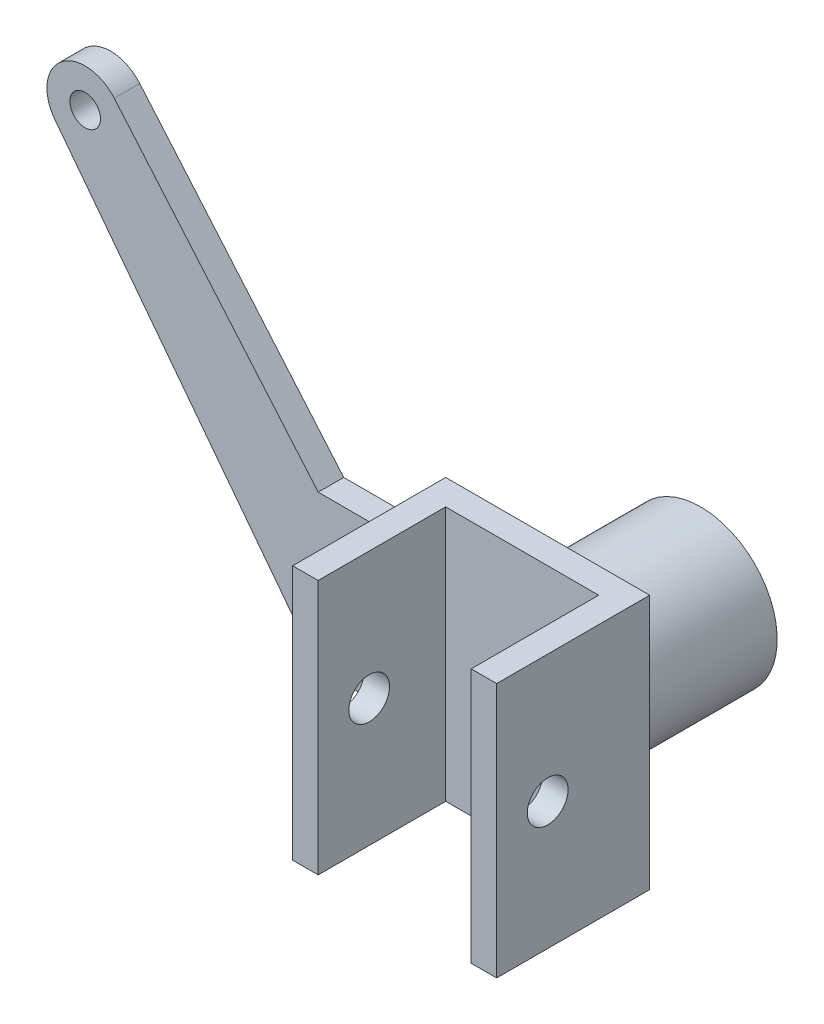
ISO-10303-21;
HEADER;
FILE_DESCRIPTION(('STEP AP214'),'2;1');
FILE_NAME('part.step','',(''),(''),'','','');
FILE_SCHEMA(('AUTOMOTIVE_DESIGN { 1 0 10303 214 1 1 1 1 }'));
ENDSEC;
DATA;
#1=APPLICATION_CONTEXT('core data for automotive mechanical design processes');
#2=APPLICATION_PROTOCOL_DEFINITION('international standard','automotive_design',2000,#1);
#3=PRODUCT_CONTEXT('',#1,'mechanical');
#4=PRODUCT('Part','Part','',(#3));
#5=PRODUCT_RELATED_PRODUCT_CATEGORY('part','',(#4));
#6=PRODUCT_DEFINITION_FORMATION('','',#4);
#7=PRODUCT_DEFINITION_CONTEXT('part definition',#1,'design');
#8=PRODUCT_DEFINITION('design','',#6,#7);
#9=PRODUCT_DEFINITION_SHAPE('','',#8);
#10=(LENGTH_UNIT() NAMED_UNIT(*) SI_UNIT(.MILLI.,.METRE.));
#11=(NAMED_UNIT(*) PLANE_ANGLE_UNIT() SI_UNIT($,.RADIAN.));
#12=(NAMED_UNIT(*) SI_UNIT($,.STERADIAN.) SOLID_ANGLE_UNIT());
#13=UNCERTAINTY_MEASURE_WITH_UNIT(LENGTH_MEASURE(1.E-05),#10,'distance_accuracy_value','');
#14=(GEOMETRIC_REPRESENTATION_CONTEXT(3) GLOBAL_UNCERTAINTY_ASSIGNED_CONTEXT((#13)) GLOBAL_UNIT_ASSIGNED_CONTEXT((#10,
#11,#12)) REPRESENTATION_CONTEXT('',''));
#15=CARTESIAN_POINT('',(0.,0.,0.));
#16=DIRECTION('',(0.,0.,1.));
#17=DIRECTION('',(1.,0.,0.));
#18=AXIS2_PLACEMENT_3D('',#15,#16,#17);
#19=CARTESIAN_POINT('',(-20.,-25.,5.));
#20=DIRECTION('',(1.,0.,0.));
#21=DIRECTION('',(0.,0.,-1.));
#22=AXIS2_PLACEMENT_3D('',#19,#20,#21);
#23=PLANE('',#22);
#24=CARTESIAN_POINT('',(-20.,0.,20.));
#25=DIRECTION('',(-1.,0.,0.));
#26=DIRECTION('',(0.,0.,1.));
#27=AXIS2_PLACEMENT_3D('',#24,#25,#26);
#28=CIRCLE('',#27,4.);
#29=CARTESIAN_POINT('',(-20.,0.,24.));
#30=VERTEX_POINT('',#29);
#31=EDGE_CURVE('E195',#30,#30,#28,.T.);
#32=ORIENTED_EDGE('',*,*,#31,.F.);
#33=EDGE_LOOP('',(#32));
#34=FACE_BOUND('',#33,.T.);
#35=DIRECTION('',(0.,0.,-1.));
#36=VECTOR('',#35,1.);
#37=CARTESIAN_POINT('',(-20.,15.,5.));
#38=LINE('',#37,#36);
#39=CARTESIAN_POINT('',(-20.,15.,5.));
#40=VERTEX_POINT('',#39);
#41=CARTESIAN_POINT('',(-20.,15.,0.));
#42=VERTEX_POINT('',#41);
#43=EDGE_CURVE('E49',#40,#42,#38,.T.);
#44=ORIENTED_EDGE('',*,*,#43,.F.);
#45=DIRECTION('',(0.,1.,0.));
#46=VECTOR('',#45,1.);
#47=CARTESIAN_POINT('',(-20.,-15.,5.));
#48=LINE('',#47,#46);
#49=CARTESIAN_POINT('',(-20.,-15.,5.));
#50=VERTEX_POINT('',#49);
#51=EDGE_CURVE('E182',#50,#40,#48,.T.);
#52=ORIENTED_EDGE('',*,*,#51,.F.);
#53=DIRECTION('',(0.,0.,1.));
#54=VECTOR('',#53,1.);
#55=CARTESIAN_POINT('',(-20.,-15.,5.));
#56=LINE('',#55,#54);
#57=CARTESIAN_POINT('',(-20.,-15.,0.));
#58=VERTEX_POINT('',#57);
#59=EDGE_CURVE('E55',#58,#50,#56,.T.);
#60=ORIENTED_EDGE('',*,*,#59,.F.);
#61=DIRECTION('',(0.,-1.,0.));
#62=VECTOR('',#61,1.);
#63=CARTESIAN_POINT('',(-20.,-25.,0.));
#64=LINE('',#63,#62);
#65=CARTESIAN_POINT('',(-20.,-25.,0.));
#66=VERTEX_POINT('',#65);
#67=EDGE_CURVE('E253',#58,#66,#64,.T.);
#68=ORIENTED_EDGE('',*,*,#67,.T.);
#69=DIRECTION('',(0.,0.,-1.));
#70=VECTOR('',#69,1.);
#71=CARTESIAN_POINT('',(-20.,-25.,5.));
#72=LINE('',#71,#70);
#73=CARTESIAN_POINT('',(-20.,-25.,30.));
#74=VERTEX_POINT('',#73);
#75=EDGE_CURVE('E259',#74,#66,#72,.T.);
#76=ORIENTED_EDGE('',*,*,#75,.F.);
#77=DIRECTION('',(0.,-1.,0.));
#78=VECTOR('',#77,1.);
#79=CARTESIAN_POINT('',(-20.,25.,30.));
#80=LINE('',#79,#78);
#81=CARTESIAN_POINT('',(-20.,25.,30.));
#82=VERTEX_POINT('',#81);
#83=EDGE_CURVE('E224',#82,#74,#80,.T.);
#84=ORIENTED_EDGE('',*,*,#83,.F.);
#85=DIRECTION('',(0.,0.,-1.));
#86=VECTOR('',#85,1.);
#87=CARTESIAN_POINT('',(-20.,25.,5.));
#88=LINE('',#87,#86);
#89=CARTESIAN_POINT('',(-20.,25.,0.));
#90=VERTEX_POINT('',#89);
#91=EDGE_CURVE('E42',#82,#90,#88,.T.);
#92=ORIENTED_EDGE('',*,*,#91,.T.);
#93=EDGE_CURVE('E254',#90,#42,#64,.T.);
#94=ORIENTED_EDGE('',*,*,#93,.T.);
#95=EDGE_LOOP('',(#44,#52,#60,#68,#76,#84,#92,#94));
#96=FACE_BOUND('',#95,.T.);
#97=ADVANCED_FACE('F33',(#34,#96),#23,.F.);
#98=CARTESIAN_POINT('',(0.,0.,5.));
#99=DIRECTION('',(0.,0.,-1.));
#100=DIRECTION('',(-1.,0.,0.));
#101=AXIS2_PLACEMENT_3D('',#98,#99,#100);
#102=PLANE('',#101);
#103=DIRECTION('',(0.,-1.,0.));
#104=VECTOR('',#103,1.);
#105=CARTESIAN_POINT('',(15.,25.,5.));
#106=LINE('',#105,#104);
#107=CARTESIAN_POINT('',(15.,25.,5.));
#108=VERTEX_POINT('',#107);
#109=CARTESIAN_POINT('',(15.,-25.,5.));
#110=VERTEX_POINT('',#109);
#111=EDGE_CURVE('E204',#108,#110,#106,.T.);
#112=ORIENTED_EDGE('',*,*,#111,.F.);
#113=DIRECTION('',(-1.,0.,0.));
#114=VECTOR('',#113,1.);
#115=CARTESIAN_POINT('',(-20.,25.,5.));
#116=LINE('',#115,#114);
#117=CARTESIAN_POINT('',(-15.,25.,5.));
#118=VERTEX_POINT('',#117);
#119=EDGE_CURVE('E243',#108,#118,#116,.T.);
#120=ORIENTED_EDGE('',*,*,#119,.T.);
#121=DIRECTION('',(0.,1.,0.));
#122=VECTOR('',#121,1.);
#123=CARTESIAN_POINT('',(-15.,25.,5.));
#124=LINE('',#123,#122);
#125=CARTESIAN_POINT('',(-15.,-25.,5.));
#126=VERTEX_POINT('',#125);
#127=EDGE_CURVE('E223',#126,#118,#124,.T.);
#128=ORIENTED_EDGE('',*,*,#127,.F.);
#129=DIRECTION('',(1.,0.,0.));
#130=VECTOR('',#129,1.);
#131=CARTESIAN_POINT('',(-20.,-25.,5.));
#132=LINE('',#131,#130);
#133=EDGE_CURVE('E245',#126,#110,#132,.T.);
#134=ORIENTED_EDGE('',*,*,#133,.T.);
#135=EDGE_LOOP('',(#112,#120,#128,#134));
#136=FACE_BOUND('',#135,.T.);
#137=ADVANCED_FACE('F289',(#136),#102,.F.);
#138=CARTESIAN_POINT('',(20.,-25.,5.));
#139=DIRECTION('',(-1.,0.,0.));
#140=DIRECTION('',(0.,0.,1.));
#141=AXIS2_PLACEMENT_3D('',#138,#139,#140);
#142=PLANE('',#141);
#143=CARTESIAN_POINT('',(20.,0.,20.));
#144=DIRECTION('',(-1.,0.,0.));
#145=DIRECTION('',(0.,0.,1.));
#146=AXIS2_PLACEMENT_3D('',#143,#144,#145);
#147=CIRCLE('',#146,4.);
#148=CARTESIAN_POINT('',(20.,0.,24.));
#149=VERTEX_POINT('',#148);
#150=EDGE_CURVE('E196',#149,#149,#147,.T.);
#151=ORIENTED_EDGE('',*,*,#150,.T.);
#152=EDGE_LOOP('',(#151));
#153=FACE_BOUND('',#152,.T.);
#154=DIRECTION('',(0.,1.,0.));
#155=VECTOR('',#154,1.);
#156=CARTESIAN_POINT('',(20.,-25.,0.));
#157=LINE('',#156,#155);
#158=CARTESIAN_POINT('',(20.,-25.,0.));
#159=VERTEX_POINT('',#158);
#160=CARTESIAN_POINT('',(20.,25.,0.));
#161=VERTEX_POINT('',#160);
#162=EDGE_CURVE('E242',#159,#161,#157,.T.);
#163=ORIENTED_EDGE('',*,*,#162,.T.);
#164=DIRECTION('',(0.,0.,-1.));
#165=VECTOR('',#164,1.);
#166=CARTESIAN_POINT('',(20.,25.,5.));
#167=LINE('',#166,#165);
#168=CARTESIAN_POINT('',(20.,25.,30.));
#169=VERTEX_POINT('',#168);
#170=EDGE_CURVE('E11',#169,#161,#167,.T.);
#171=ORIENTED_EDGE('',*,*,#170,.F.);
#172=DIRECTION('',(0.,1.,0.));
#173=VECTOR('',#172,1.);
#174=CARTESIAN_POINT('',(20.,25.,30.));
#175=LINE('',#174,#173);
#176=CARTESIAN_POINT('',(20.,-25.,30.));
#177=VERTEX_POINT('',#176);
#178=EDGE_CURVE('E205',#177,#169,#175,.T.);
#179=ORIENTED_EDGE('',*,*,#178,.F.);
#180=DIRECTION('',(0.,0.,-1.));
#181=VECTOR('',#180,1.);
#182=CARTESIAN_POINT('',(20.,-25.,5.));
#183=LINE('',#182,#181);
#184=EDGE_CURVE('E248',#177,#159,#183,.T.);
#185=ORIENTED_EDGE('',*,*,#184,.T.);
#186=EDGE_LOOP('',(#163,#171,#179,#185));
#187=FACE_BOUND('',#186,.T.);
#188=ADVANCED_FACE('F35',(#153,#187),#142,.F.);
#189=CARTESIAN_POINT('',(-20.,25.,5.));
#190=DIRECTION('',(0.,-1.,0.));
#191=DIRECTION('',(0.,0.,-1.));
#192=AXIS2_PLACEMENT_3D('',#189,#190,#191);
#193=PLANE('',#192);
#194=DIRECTION('',(-1.,0.,0.));
#195=VECTOR('',#194,1.);
#196=CARTESIAN_POINT('',(-20.,25.,0.));
#197=LINE('',#196,#195);
#198=EDGE_CURVE('E251',#161,#90,#197,.T.);
#199=ORIENTED_EDGE('',*,*,#198,.T.);
#200=ORIENTED_EDGE('',*,*,#91,.F.);
#201=DIRECTION('',(-1.,0.,0.));
#202=VECTOR('',#201,1.);
#203=CARTESIAN_POINT('',(-20.,25.,30.));
#204=LINE('',#203,#202);
#205=CARTESIAN_POINT('',(-15.,25.,30.));
#206=VERTEX_POINT('',#205);
#207=EDGE_CURVE('E231',#206,#82,#204,.T.);
#208=ORIENTED_EDGE('',*,*,#207,.F.);
#209=DIRECTION('',(0.,0.,-1.));
#210=VECTOR('',#209,1.);
#211=CARTESIAN_POINT('',(-15.,25.,30.));
#212=LINE('',#211,#210);
#213=EDGE_CURVE('E234',#206,#118,#212,.T.);
#214=ORIENTED_EDGE('',*,*,#213,.T.);
#215=ORIENTED_EDGE('',*,*,#119,.F.);
#216=DIRECTION('',(0.,0.,-1.));
#217=VECTOR('',#216,1.);
#218=CARTESIAN_POINT('',(15.,25.,30.));
#219=LINE('',#218,#217);
#220=CARTESIAN_POINT('',(15.,25.,30.));
#221=VERTEX_POINT('',#220);
#222=EDGE_CURVE('E220',#221,#108,#219,.T.);
#223=ORIENTED_EDGE('',*,*,#222,.F.);
#224=DIRECTION('',(-1.,0.,0.));
#225=VECTOR('',#224,1.);
#226=CARTESIAN_POINT('',(20.,25.,30.));
#227=LINE('',#226,#225);
#228=EDGE_CURVE('E208',#169,#221,#227,.T.);
#229=ORIENTED_EDGE('',*,*,#228,.F.);
#230=ORIENTED_EDGE('',*,*,#170,.T.);
#231=EDGE_LOOP('',(#199,#200,#208,#214,#215,#223,#229,#230));
#232=FACE_BOUND('',#231,.T.);
#233=ADVANCED_FACE('F301',(#232),#193,.F.);
#234=CARTESIAN_POINT('',(-20.,-25.,5.));
#235=DIRECTION('',(0.,1.,0.));
#236=DIRECTION('',(0.,0.,1.));
#237=AXIS2_PLACEMENT_3D('',#234,#235,#236);
#238=PLANE('',#237);
#239=DIRECTION('',(1.,0.,0.));
#240=VECTOR('',#239,1.);
#241=CARTESIAN_POINT('',(-20.,-25.,0.));
#242=LINE('',#241,#240);
#243=EDGE_CURVE('E246',#66,#159,#242,.T.);
#244=ORIENTED_EDGE('',*,*,#243,.T.);
#245=ORIENTED_EDGE('',*,*,#184,.F.);
#246=DIRECTION('',(1.,0.,0.));
#247=VECTOR('',#246,1.);
#248=CARTESIAN_POINT('',(20.,-25.,30.));
#249=LINE('',#248,#247);
#250=CARTESIAN_POINT('',(15.,-25.,30.));
#251=VERTEX_POINT('',#250);
#252=EDGE_CURVE('E212',#251,#177,#249,.T.);
#253=ORIENTED_EDGE('',*,*,#252,.F.);
#254=DIRECTION('',(0.,0.,-1.));
#255=VECTOR('',#254,1.);
#256=CARTESIAN_POINT('',(15.,-25.,30.));
#257=LINE('',#256,#255);
#258=EDGE_CURVE('E215',#251,#110,#257,.T.);
#259=ORIENTED_EDGE('',*,*,#258,.T.);
#260=ORIENTED_EDGE('',*,*,#133,.F.);
#261=DIRECTION('',(0.,0.,-1.));
#262=VECTOR('',#261,1.);
#263=CARTESIAN_POINT('',(-15.,-25.,30.));
#264=LINE('',#263,#262);
#265=CARTESIAN_POINT('',(-15.,-25.,30.));
#266=VERTEX_POINT('',#265);
#267=EDGE_CURVE('E239',#266,#126,#264,.T.);
#268=ORIENTED_EDGE('',*,*,#267,.F.);
#269=DIRECTION('',(1.,0.,0.));
#270=VECTOR('',#269,1.);
#271=CARTESIAN_POINT('',(-20.,-25.,30.));
#272=LINE('',#271,#270);
#273=EDGE_CURVE('E227',#74,#266,#272,.T.);
#274=ORIENTED_EDGE('',*,*,#273,.F.);
#275=ORIENTED_EDGE('',*,*,#75,.T.);
#276=EDGE_LOOP('',(#244,#245,#253,#259,#260,#268,#274,#275));
#277=FACE_BOUND('',#276,.T.);
#278=ADVANCED_FACE('F299',(#277),#238,.F.);
#279=CARTESIAN_POINT('',(0.,0.,0.));
#280=DIRECTION('',(0.,0.,-1.));
#281=DIRECTION('',(-1.,0.,0.));
#282=AXIS2_PLACEMENT_3D('',#279,#280,#281);
#283=PLANE('',#282);
#284=CARTESIAN_POINT('',(0.,0.,0.));
#285=DIRECTION('',(0.,0.,-1.));
#286=DIRECTION('',(-1.,0.,0.));
#287=AXIS2_PLACEMENT_3D('',#284,#285,#286);
#288=CIRCLE('',#287,15.);
#289=CARTESIAN_POINT('',(-15.,0.,0.));
#290=VERTEX_POINT('',#289);
#291=EDGE_CURVE('E354',#290,#290,#288,.T.);
#292=ORIENTED_EDGE('',*,*,#291,.F.);
#293=EDGE_LOOP('',(#292));
#294=FACE_BOUND('',#293,.T.);
#295=ORIENTED_EDGE('',*,*,#162,.F.);
#296=ORIENTED_EDGE('',*,*,#243,.F.);
#297=ORIENTED_EDGE('',*,*,#67,.F.);
#298=DIRECTION('',(1.,0.,0.));
#299=VECTOR('',#298,1.);
#300=CARTESIAN_POINT('',(-40.,-15.,0.));
#301=LINE('',#300,#299);
#302=CARTESIAN_POINT('',(-40.,-15.,0.));
#303=VERTEX_POINT('',#302);
#304=EDGE_CURVE('E192',#303,#58,#301,.T.);
#305=ORIENTED_EDGE('',*,*,#304,.F.);
#306=DIRECTION('',(0.607773308705075,-0.794110574936316,0.));
#307=VECTOR('',#306,1.);
#308=CARTESIAN_POINT('',(-91.6419001211187,52.4747943165852,0.));
#309=LINE('',#308,#307);
#310=CARTESIAN_POINT('',(-91.6419001211187,52.4747943165852,0.));
#311=VERTEX_POINT('',#310);
#312=EDGE_CURVE('E145',#311,#303,#309,.T.);
#313=ORIENTED_EDGE('',*,*,#312,.F.);
#314=CARTESIAN_POINT('',(-85.6860708090963,57.0330941318732,0.));
#315=DIRECTION('',(0.,0.,1.));
#316=DIRECTION('',(1.,0.,0.));
#317=AXIS2_PLACEMENT_3D('',#314,#315,#316);
#318=CIRCLE('',#317,7.5);
#319=CARTESIAN_POINT('',(-79.978416938153,61.8985527217192,0.));
#320=VERTEX_POINT('',#319);
#321=EDGE_CURVE('E137',#320,#311,#318,.T.);
#322=ORIENTED_EDGE('',*,*,#321,.F.);
#323=DIRECTION('',(-0.648727811979465,0.761020516125771,0.));
#324=VECTOR('',#323,1.);
#325=CARTESIAN_POINT('',(-79.978416938153,61.8985527217192,0.));
#326=LINE('',#325,#324);
#327=CARTESIAN_POINT('',(-40.,15.,0.));
#328=VERTEX_POINT('',#327);
#329=EDGE_CURVE('E154',#328,#320,#326,.T.);
#330=ORIENTED_EDGE('',*,*,#329,.F.);
#331=DIRECTION('',(1.,0.,0.));
#332=VECTOR('',#331,1.);
#333=CARTESIAN_POINT('',(-40.,15.,0.));
#334=LINE('',#333,#332);
#335=EDGE_CURVE('E180',#328,#42,#334,.T.);
#336=ORIENTED_EDGE('',*,*,#335,.T.);
#337=ORIENTED_EDGE('',*,*,#93,.F.);
#338=ORIENTED_EDGE('',*,*,#198,.F.);
#339=EDGE_LOOP('',(#295,#296,#297,#305,#313,#322,#330,#336,#337,#338));
#340=FACE_BOUND('',#339,.T.);
#341=CARTESIAN_POINT('',(-85.6860708090963,57.0330941318732,0.));
#342=DIRECTION('',(0.,0.,1.));
#343=DIRECTION('',(1.,0.,0.));
#344=AXIS2_PLACEMENT_3D('',#341,#342,#343);
#345=CIRCLE('',#344,2.99999999999886);
#346=CARTESIAN_POINT('',(-82.6860708090975,57.0330941318732,0.));
#347=VERTEX_POINT('',#346);
#348=EDGE_CURVE('E173',#347,#347,#345,.T.);
#349=ORIENTED_EDGE('',*,*,#348,.T.);
#350=EDGE_LOOP('',(#349));
#351=FACE_BOUND('',#350,.T.);
#352=ADVANCED_FACE('F151',(#294,#340,#351),#283,.T.);
#353=CARTESIAN_POINT('',(-15.,25.,30.));
#354=DIRECTION('',(-1.,0.,0.));
#355=DIRECTION('',(0.,-1.,0.));
#356=AXIS2_PLACEMENT_3D('',#353,#354,#355);
#357=PLANE('',#356);
#358=CARTESIAN_POINT('',(-15.,0.,20.));
#359=DIRECTION('',(-1.,0.,0.));
#360=DIRECTION('',(0.,-1.,0.));
#361=AXIS2_PLACEMENT_3D('',#358,#359,#360);
#362=CIRCLE('',#361,4.);
#363=CARTESIAN_POINT('',(-15.,-4.,20.));
#364=VERTEX_POINT('',#363);
#365=EDGE_CURVE('E201',#364,#364,#362,.T.);
#366=ORIENTED_EDGE('',*,*,#365,.T.);
#367=EDGE_LOOP('',(#366));
#368=FACE_BOUND('',#367,.T.);
#369=ORIENTED_EDGE('',*,*,#127,.T.);
#370=ORIENTED_EDGE('',*,*,#213,.F.);
#371=DIRECTION('',(0.,1.,0.));
#372=VECTOR('',#371,1.);
#373=CARTESIAN_POINT('',(-15.,25.,30.));
#374=LINE('',#373,#372);
#375=EDGE_CURVE('E229',#266,#206,#374,.T.);
#376=ORIENTED_EDGE('',*,*,#375,.F.);
#377=ORIENTED_EDGE('',*,*,#267,.T.);
#378=EDGE_LOOP('',(#369,#370,#376,#377));
#379=FACE_BOUND('',#378,.T.);
#380=ADVANCED_FACE('F323',(#368,#379),#357,.F.);
#381=CARTESIAN_POINT('',(0.,0.,30.));
#382=DIRECTION('',(0.,0.,1.));
#383=DIRECTION('',(1.,0.,0.));
#384=AXIS2_PLACEMENT_3D('',#381,#382,#383);
#385=PLANE('',#384);
#386=ORIENTED_EDGE('',*,*,#83,.T.);
#387=ORIENTED_EDGE('',*,*,#273,.T.);
#388=ORIENTED_EDGE('',*,*,#375,.T.);
#389=ORIENTED_EDGE('',*,*,#207,.T.);
#390=EDGE_LOOP('',(#386,#387,#388,#389));
#391=FACE_BOUND('',#390,.T.);
#392=ADVANCED_FACE('F319',(#391),#385,.T.);
#393=CARTESIAN_POINT('',(15.,25.,30.));
#394=DIRECTION('',(1.,0.,0.));
#395=DIRECTION('',(0.,1.,0.));
#396=AXIS2_PLACEMENT_3D('',#393,#394,#395);
#397=PLANE('',#396);
#398=CARTESIAN_POINT('',(15.,0.,20.));
#399=DIRECTION('',(1.,0.,0.));
#400=DIRECTION('',(0.,1.,0.));
#401=AXIS2_PLACEMENT_3D('',#398,#399,#400);
#402=CIRCLE('',#401,4.);
#403=CARTESIAN_POINT('',(15.,4.,20.));
#404=VERTEX_POINT('',#403);
#405=EDGE_CURVE('E37',#404,#404,#402,.T.);
#406=ORIENTED_EDGE('',*,*,#405,.T.);
#407=EDGE_LOOP('',(#406));
#408=FACE_BOUND('',#407,.T.);
#409=ORIENTED_EDGE('',*,*,#111,.T.);
#410=ORIENTED_EDGE('',*,*,#258,.F.);
#411=DIRECTION('',(0.,-1.,0.));
#412=VECTOR('',#411,1.);
#413=CARTESIAN_POINT('',(15.,25.,30.));
#414=LINE('',#413,#412);
#415=EDGE_CURVE('E210',#221,#251,#414,.T.);
#416=ORIENTED_EDGE('',*,*,#415,.F.);
#417=ORIENTED_EDGE('',*,*,#222,.T.);
#418=EDGE_LOOP('',(#409,#410,#416,#417));
#419=FACE_BOUND('',#418,.T.);
#420=ADVANCED_FACE('F327',(#408,#419),#397,.F.);
#421=CARTESIAN_POINT('',(0.,0.,30.));
#422=DIRECTION('',(0.,0.,-1.));
#423=DIRECTION('',(-1.,0.,0.));
#424=AXIS2_PLACEMENT_3D('',#421,#422,#423);
#425=PLANE('',#424);
#426=ORIENTED_EDGE('',*,*,#178,.T.);
#427=ORIENTED_EDGE('',*,*,#228,.T.);
#428=ORIENTED_EDGE('',*,*,#415,.T.);
#429=ORIENTED_EDGE('',*,*,#252,.T.);
#430=EDGE_LOOP('',(#426,#427,#428,#429));
#431=FACE_BOUND('',#430,.T.);
#432=ADVANCED_FACE('F329',(#431),#425,.F.);
#433=CARTESIAN_POINT('',(20.,0.,20.));
#434=DIRECTION('',(-1.,0.,0.));
#435=DIRECTION('',(0.,0.,1.));
#436=AXIS2_PLACEMENT_3D('',#433,#434,#435);
#437=CYLINDRICAL_SURFACE('',#436,4.);
#438=ORIENTED_EDGE('',*,*,#150,.F.);
#439=EDGE_LOOP('',(#438));
#440=FACE_BOUND('',#439,.T.);
#441=ORIENTED_EDGE('',*,*,#405,.F.);
#442=EDGE_LOOP('',(#441));
#443=FACE_BOUND('',#442,.T.);
#444=ADVANCED_FACE('F331',(#440,#443),#437,.F.);
#445=ORIENTED_EDGE('',*,*,#31,.T.);
#446=EDGE_LOOP('',(#445));
#447=FACE_BOUND('',#446,.T.);
#448=ORIENTED_EDGE('',*,*,#365,.F.);
#449=EDGE_LOOP('',(#448));
#450=FACE_BOUND('',#449,.T.);
#451=ADVANCED_FACE('F337',(#447,#450),#437,.F.);
#452=CARTESIAN_POINT('',(-40.,-15.,5.));
#453=DIRECTION('',(0.,1.,0.));
#454=DIRECTION('',(0.,0.,1.));
#455=AXIS2_PLACEMENT_3D('',#452,#453,#454);
#456=PLANE('',#455);
#457=ORIENTED_EDGE('',*,*,#59,.T.);
#458=DIRECTION('',(1.,0.,0.));
#459=VECTOR('',#458,1.);
#460=CARTESIAN_POINT('',(-40.,-15.,5.));
#461=LINE('',#460,#459);
#462=CARTESIAN_POINT('',(-40.,-15.,5.));
#463=VERTEX_POINT('',#462);
#464=EDGE_CURVE('E189',#463,#50,#461,.T.);
#465=ORIENTED_EDGE('',*,*,#464,.F.);
#466=DIRECTION('',(0.,0.,1.));
#467=VECTOR('',#466,1.);
#468=CARTESIAN_POINT('',(-40.,-15.,5.));
#469=LINE('',#468,#467);
#470=EDGE_CURVE('E176',#303,#463,#469,.T.);
#471=ORIENTED_EDGE('',*,*,#470,.F.);
#472=ORIENTED_EDGE('',*,*,#304,.T.);
#473=EDGE_LOOP('',(#457,#465,#471,#472));
#474=FACE_BOUND('',#473,.T.);
#475=ADVANCED_FACE('F273',(#474),#456,.F.);
#476=CARTESIAN_POINT('',(-40.,-15.,5.));
#477=DIRECTION('',(0.,0.,-1.));
#478=DIRECTION('',(0.,1.,0.));
#479=AXIS2_PLACEMENT_3D('',#476,#477,#478);
#480=PLANE('',#479);
#481=ORIENTED_EDGE('',*,*,#51,.T.);
#482=DIRECTION('',(1.,0.,0.));
#483=VECTOR('',#482,1.);
#484=CARTESIAN_POINT('',(-40.,15.,5.));
#485=LINE('',#484,#483);
#486=CARTESIAN_POINT('',(-40.,15.,5.));
#487=VERTEX_POINT('',#486);
#488=EDGE_CURVE('E186',#487,#40,#485,.T.);
#489=ORIENTED_EDGE('',*,*,#488,.F.);
#490=DIRECTION('',(-0.648727811979465,0.761020516125771,0.));
#491=VECTOR('',#490,1.);
#492=CARTESIAN_POINT('',(-79.978416938153,61.8985527217192,5.));
#493=LINE('',#492,#491);
#494=CARTESIAN_POINT('',(-79.978416938153,61.8985527217192,5.));
#495=VERTEX_POINT('',#494);
#496=EDGE_CURVE('E171',#487,#495,#493,.T.);
#497=ORIENTED_EDGE('',*,*,#496,.T.);
#498=CARTESIAN_POINT('',(-85.6860708090963,57.0330941318732,5.));
#499=DIRECTION('',(0.,0.,1.));
#500=DIRECTION('',(1.,0.,0.));
#501=AXIS2_PLACEMENT_3D('',#498,#499,#500);
#502=CIRCLE('',#501,7.5);
#503=CARTESIAN_POINT('',(-91.6419001211187,52.4747943165852,5.));
#504=VERTEX_POINT('',#503);
#505=EDGE_CURVE('E139',#495,#504,#502,.T.);
#506=ORIENTED_EDGE('',*,*,#505,.T.);
#507=DIRECTION('',(0.607773308705075,-0.794110574936316,0.));
#508=VECTOR('',#507,1.);
#509=CARTESIAN_POINT('',(-91.6419001211187,52.4747943165852,5.));
#510=LINE('',#509,#508);
#511=EDGE_CURVE('E162',#504,#463,#510,.T.);
#512=ORIENTED_EDGE('',*,*,#511,.T.);
#513=ORIENTED_EDGE('',*,*,#464,.T.);
#514=EDGE_LOOP('',(#481,#489,#497,#506,#512,#513));
#515=FACE_BOUND('',#514,.T.);
#516=CARTESIAN_POINT('',(-85.6860708090963,57.0330941318732,5.));
#517=DIRECTION('',(0.,0.,1.));
#518=DIRECTION('',(1.,0.,0.));
#519=AXIS2_PLACEMENT_3D('',#516,#517,#518);
#520=CIRCLE('',#519,2.99999999999886);
#521=CARTESIAN_POINT('',(-82.6860708090975,57.0330941318732,5.));
#522=VERTEX_POINT('',#521);
#523=EDGE_CURVE('E167',#522,#522,#520,.T.);
#524=ORIENTED_EDGE('',*,*,#523,.F.);
#525=EDGE_LOOP('',(#524));
#526=FACE_BOUND('',#525,.T.);
#527=ADVANCED_FACE('F270',(#515,#526),#480,.F.);
#528=CARTESIAN_POINT('',(-40.,15.,5.));
#529=DIRECTION('',(0.,-1.,0.));
#530=DIRECTION('',(0.,0.,-1.));
#531=AXIS2_PLACEMENT_3D('',#528,#529,#530);
#532=PLANE('',#531);
#533=ORIENTED_EDGE('',*,*,#43,.T.);
#534=ORIENTED_EDGE('',*,*,#335,.F.);
#535=DIRECTION('',(0.,0.,-1.));
#536=VECTOR('',#535,1.);
#537=CARTESIAN_POINT('',(-40.,15.,5.));
#538=LINE('',#537,#536);
#539=EDGE_CURVE('E161',#487,#328,#538,.T.);
#540=ORIENTED_EDGE('',*,*,#539,.F.);
#541=ORIENTED_EDGE('',*,*,#488,.T.);
#542=EDGE_LOOP('',(#533,#534,#540,#541));
#543=FACE_BOUND('',#542,.T.);
#544=ADVANCED_FACE('F268',(#543),#532,.F.);
#545=CARTESIAN_POINT('',(-79.978416938153,61.8985527217192,0.));
#546=DIRECTION('',(0.761020516125771,0.648727811979465,0.));
#547=DIRECTION('',(-0.648727811979465,0.761020516125771,0.));
#548=AXIS2_PLACEMENT_3D('',#545,#546,#547);
#549=PLANE('',#548);
#550=ORIENTED_EDGE('',*,*,#496,.F.);
#551=ORIENTED_EDGE('',*,*,#539,.T.);
#552=ORIENTED_EDGE('',*,*,#329,.T.);
#553=DIRECTION('',(0.,0.,1.));
#554=VECTOR('',#553,1.);
#555=CARTESIAN_POINT('',(-79.978416938153,61.8985527217192,0.));
#556=LINE('',#555,#554);
#557=EDGE_CURVE('E134',#320,#495,#556,.T.);
#558=ORIENTED_EDGE('',*,*,#557,.T.);
#559=EDGE_LOOP('',(#550,#551,#552,#558));
#560=FACE_BOUND('',#559,.T.);
#561=ADVANCED_FACE('F159',(#560),#549,.T.);
#562=CARTESIAN_POINT('',(-91.6419001211187,52.4747943165852,0.));
#563=DIRECTION('',(-0.794110574936316,-0.607773308705075,0.));
#564=DIRECTION('',(0.607773308705075,-0.794110574936316,0.));
#565=AXIS2_PLACEMENT_3D('',#562,#563,#564);
#566=PLANE('',#565);
#567=ORIENTED_EDGE('',*,*,#511,.F.);
#568=DIRECTION('',(0.,0.,1.));
#569=VECTOR('',#568,1.);
#570=CARTESIAN_POINT('',(-91.6419001211187,52.4747943165852,0.));
#571=LINE('',#570,#569);
#572=EDGE_CURVE('E144',#311,#504,#571,.T.);
#573=ORIENTED_EDGE('',*,*,#572,.F.);
#574=ORIENTED_EDGE('',*,*,#312,.T.);
#575=ORIENTED_EDGE('',*,*,#470,.T.);
#576=EDGE_LOOP('',(#567,#573,#574,#575));
#577=FACE_BOUND('',#576,.T.);
#578=ADVANCED_FACE('F277',(#577),#566,.T.);
#579=CARTESIAN_POINT('',(-85.6860708090963,57.0330941318732,0.));
#580=DIRECTION('',(0.,0.,1.));
#581=DIRECTION('',(1.,0.,0.));
#582=AXIS2_PLACEMENT_3D('',#579,#580,#581);
#583=CYLINDRICAL_SURFACE('',#582,7.5);
#584=ORIENTED_EDGE('',*,*,#505,.F.);
#585=ORIENTED_EDGE('',*,*,#557,.F.);
#586=ORIENTED_EDGE('',*,*,#321,.T.);
#587=ORIENTED_EDGE('',*,*,#572,.T.);
#588=EDGE_LOOP('',(#584,#585,#586,#587));
#589=FACE_BOUND('',#588,.T.);
#590=ADVANCED_FACE('F136',(#589),#583,.T.);
#591=CARTESIAN_POINT('',(-85.6860708090963,57.0330941318732,0.));
#592=DIRECTION('',(0.,0.,1.));
#593=DIRECTION('',(1.,0.,0.));
#594=AXIS2_PLACEMENT_3D('',#591,#592,#593);
#595=CYLINDRICAL_SURFACE('',#594,2.99999999999886);
#596=ORIENTED_EDGE('',*,*,#348,.F.);
#597=EDGE_LOOP('',(#596));
#598=FACE_BOUND('',#597,.T.);
#599=ORIENTED_EDGE('',*,*,#523,.T.);
#600=EDGE_LOOP('',(#599));
#601=FACE_BOUND('',#600,.T.);
#602=ADVANCED_FACE('F284',(#598,#601),#595,.F.);
#603=CARTESIAN_POINT('',(0.,0.,-30.));
#604=DIRECTION('',(0.,0.,1.));
#605=DIRECTION('',(1.,0.,0.));
#606=AXIS2_PLACEMENT_3D('',#603,#604,#605);
#607=CYLINDRICAL_SURFACE('',#606,15.);
#608=CARTESIAN_POINT('',(0.,0.,-30.));
#609=DIRECTION('',(0.,0.,-1.));
#610=DIRECTION('',(-1.,0.,0.));
#611=AXIS2_PLACEMENT_3D('',#608,#609,#610);
#612=CIRCLE('',#611,15.);
#613=CARTESIAN_POINT('',(-15.,0.,-30.));
#614=VERTEX_POINT('',#613);
#615=EDGE_CURVE('E356',#614,#614,#612,.T.);
#616=ORIENTED_EDGE('',*,*,#615,.F.);
#617=EDGE_LOOP('',(#616));
#618=FACE_BOUND('',#617,.T.);
#619=ORIENTED_EDGE('',*,*,#291,.T.);
#620=EDGE_LOOP('',(#619));
#621=FACE_BOUND('',#620,.T.);
#622=ADVANCED_FACE('F497',(#618,#621),#607,.T.);
#623=CARTESIAN_POINT('',(0.,0.,-30.));
#624=DIRECTION('',(0.,0.,-1.));
#625=DIRECTION('',(-1.,0.,0.));
#626=AXIS2_PLACEMENT_3D('',#623,#624,#625);
#627=PLANE('',#626);
#628=ORIENTED_EDGE('',*,*,#615,.T.);
#629=EDGE_LOOP('',(#628));
#630=FACE_BOUND('',#629,.T.);
#631=ADVANCED_FACE('F508',(#630),#627,.T.);
#632=CLOSED_SHELL('',(#97,#137,#188,#233,#278,#352,#380,#392,#420,#432,#444,#451,#475,#527,#544,
#561,#578,#590,#602,#622,#631));
#633=MANIFOLD_SOLID_BREP('B2',#632);
#634=ADVANCED_BREP_SHAPE_REPRESENTATION('',(#18,#633),#14);
#635=SHAPE_DEFINITION_REPRESENTATION(#9,#634);
ENDSEC;
END-ISO-10303-21;
